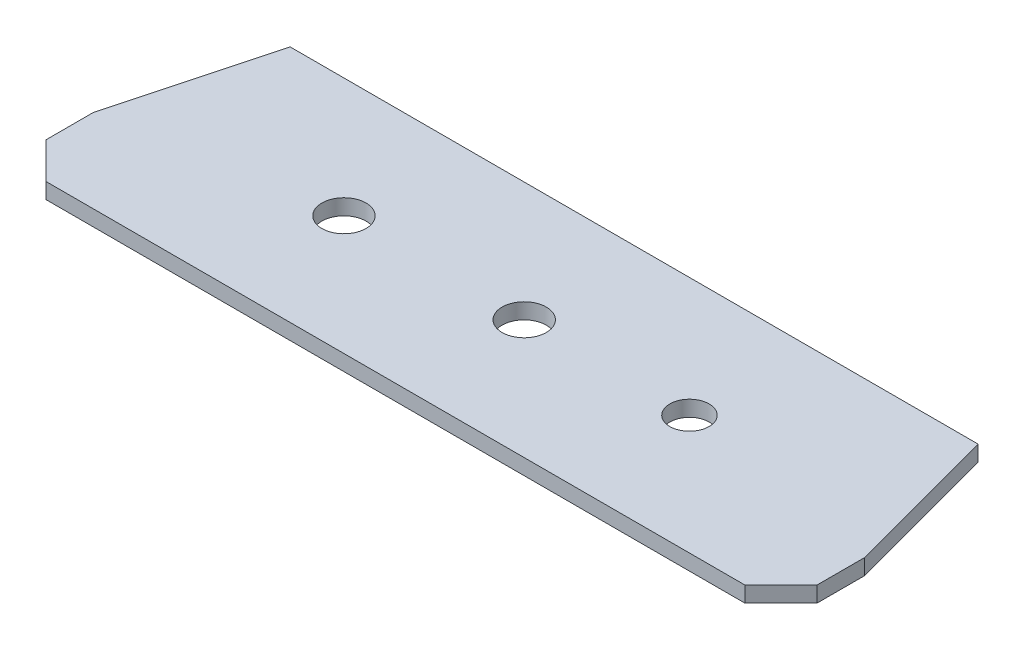
ISO-10303-21;
HEADER;
FILE_DESCRIPTION(('STEP AP214'),'2;1');
FILE_NAME('part.step','',(''),(''),'','','');
FILE_SCHEMA(('AUTOMOTIVE_DESIGN { 1 0 10303 214 1 1 1 1 }'));
ENDSEC;
DATA;
#1=APPLICATION_CONTEXT('core data for automotive mechanical design processes');
#2=APPLICATION_PROTOCOL_DEFINITION('international standard','automotive_design',2000,#1);
#3=PRODUCT_CONTEXT('',#1,'mechanical');
#4=PRODUCT('Part','Part','',(#3));
#5=PRODUCT_RELATED_PRODUCT_CATEGORY('part','',(#4));
#6=PRODUCT_DEFINITION_FORMATION('','',#4);
#7=PRODUCT_DEFINITION_CONTEXT('part definition',#1,'design');
#8=PRODUCT_DEFINITION('design','',#6,#7);
#9=PRODUCT_DEFINITION_SHAPE('','',#8);
#10=(LENGTH_UNIT() NAMED_UNIT(*) SI_UNIT(.MILLI.,.METRE.));
#11=(NAMED_UNIT(*) PLANE_ANGLE_UNIT() SI_UNIT($,.RADIAN.));
#12=(NAMED_UNIT(*) SI_UNIT($,.STERADIAN.) SOLID_ANGLE_UNIT());
#13=UNCERTAINTY_MEASURE_WITH_UNIT(LENGTH_MEASURE(1.E-05),#10,'distance_accuracy_value','');
#14=(GEOMETRIC_REPRESENTATION_CONTEXT(3) GLOBAL_UNCERTAINTY_ASSIGNED_CONTEXT((#13)) GLOBAL_UNIT_ASSIGNED_CONTEXT((#10,
#11,#12)) REPRESENTATION_CONTEXT('',''));
#15=CARTESIAN_POINT('',(0.,0.,0.));
#16=DIRECTION('',(0.,0.,1.));
#17=DIRECTION('',(1.,0.,0.));
#18=AXIS2_PLACEMENT_3D('',#15,#16,#17);
#19=CARTESIAN_POINT('',(-38.6715,2.54,38.6715));
#20=DIRECTION('',(-0.707106781186548,0.,0.707106781186547));
#21=DIRECTION('',(0.707106781186547,0.,0.707106781186548));
#22=AXIS2_PLACEMENT_3D('',#19,#20,#21);
#23=PLANE('',#22);
#24=DIRECTION('',(-0.707106781186547,0.,-0.707106781186548));
#25=VECTOR('',#24,1.);
#26=CARTESIAN_POINT('',(-38.6715,0.,38.6715));
#27=LINE('',#26,#25);
#28=CARTESIAN_POINT('',(-58.039,0.,19.304));
#29=VERTEX_POINT('',#28);
#30=CARTESIAN_POINT('',(-63.881,0.,13.462));
#31=VERTEX_POINT('',#30);
#32=EDGE_CURVE('E128',#29,#31,#27,.T.);
#33=ORIENTED_EDGE('',*,*,#32,.F.);
#34=DIRECTION('',(0.,-1.,0.));
#35=VECTOR('',#34,1.);
#36=CARTESIAN_POINT('',(-58.039,2.54,19.304));
#37=LINE('',#36,#35);
#38=CARTESIAN_POINT('',(-58.039,2.54,19.304));
#39=VERTEX_POINT('',#38);
#40=EDGE_CURVE('E11',#39,#29,#37,.T.);
#41=ORIENTED_EDGE('',*,*,#40,.F.);
#42=DIRECTION('',(-0.707106781186547,0.,-0.707106781186548));
#43=VECTOR('',#42,1.);
#44=CARTESIAN_POINT('',(-38.6715,2.54,38.6715));
#45=LINE('',#44,#43);
#46=CARTESIAN_POINT('',(-63.881,2.54,13.462));
#47=VERTEX_POINT('',#46);
#48=EDGE_CURVE('E146',#39,#47,#45,.T.);
#49=ORIENTED_EDGE('',*,*,#48,.T.);
#50=DIRECTION('',(0.,-1.,0.));
#51=VECTOR('',#50,1.);
#52=CARTESIAN_POINT('',(-63.881,2.54,13.462));
#53=LINE('',#52,#51);
#54=EDGE_CURVE('E51',#47,#31,#53,.T.);
#55=ORIENTED_EDGE('',*,*,#54,.T.);
#56=EDGE_LOOP('',(#33,#41,#49,#55));
#57=FACE_BOUND('',#56,.T.);
#58=ADVANCED_FACE('F35',(#57),#23,.T.);
#59=CARTESIAN_POINT('',(0.,2.54,19.304));
#60=DIRECTION('',(0.,0.,-1.));
#61=DIRECTION('',(-1.,0.,0.));
#62=AXIS2_PLACEMENT_3D('',#59,#60,#61);
#63=PLANE('',#62);
#64=DIRECTION('',(1.,0.,0.));
#65=VECTOR('',#64,1.);
#66=CARTESIAN_POINT('',(0.,0.,19.304));
#67=LINE('',#66,#65);
#68=CARTESIAN_POINT('',(54.991,0.,19.304));
#69=VERTEX_POINT('',#68);
#70=EDGE_CURVE('E130',#29,#69,#67,.T.);
#71=ORIENTED_EDGE('',*,*,#70,.T.);
#72=DIRECTION('',(0.,-1.,0.));
#73=VECTOR('',#72,1.);
#74=CARTESIAN_POINT('',(54.991,2.54,19.304));
#75=LINE('',#74,#73);
#76=CARTESIAN_POINT('',(54.991,2.54,19.304));
#77=VERTEX_POINT('',#76);
#78=EDGE_CURVE('E43',#77,#69,#75,.T.);
#79=ORIENTED_EDGE('',*,*,#78,.F.);
#80=DIRECTION('',(1.,0.,0.));
#81=VECTOR('',#80,1.);
#82=CARTESIAN_POINT('',(0.,2.54,19.304));
#83=LINE('',#82,#81);
#84=EDGE_CURVE('E179',#39,#77,#83,.T.);
#85=ORIENTED_EDGE('',*,*,#84,.F.);
#86=ORIENTED_EDGE('',*,*,#40,.T.);
#87=EDGE_LOOP('',(#71,#79,#85,#86));
#88=FACE_BOUND('',#87,.T.);
#89=ADVANCED_FACE('F230',(#88),#63,.F.);
#90=CARTESIAN_POINT('',(37.1475000000001,2.54,37.1475));
#91=DIRECTION('',(-0.707106781186549,0.,-0.707106781186546));
#92=DIRECTION('',(-0.707106781186546,0.,0.707106781186549));
#93=AXIS2_PLACEMENT_3D('',#90,#91,#92);
#94=PLANE('',#93);
#95=DIRECTION('',(0.707106781186546,0.,-0.707106781186549));
#96=VECTOR('',#95,1.);
#97=CARTESIAN_POINT('',(37.1475000000001,0.,37.1475));
#98=LINE('',#97,#96);
#99=CARTESIAN_POINT('',(60.833,0.,13.462));
#100=VERTEX_POINT('',#99);
#101=EDGE_CURVE('E133',#69,#100,#98,.T.);
#102=ORIENTED_EDGE('',*,*,#101,.T.);
#103=DIRECTION('',(0.,-1.,0.));
#104=VECTOR('',#103,1.);
#105=CARTESIAN_POINT('',(60.833,2.54,13.462));
#106=LINE('',#105,#104);
#107=CARTESIAN_POINT('',(60.833,2.54,13.462));
#108=VERTEX_POINT('',#107);
#109=EDGE_CURVE('E153',#108,#100,#106,.T.);
#110=ORIENTED_EDGE('',*,*,#109,.F.);
#111=DIRECTION('',(0.707106781186546,0.,-0.707106781186549));
#112=VECTOR('',#111,1.);
#113=CARTESIAN_POINT('',(37.1475000000001,2.54,37.1475));
#114=LINE('',#113,#112);
#115=EDGE_CURVE('E162',#77,#108,#114,.T.);
#116=ORIENTED_EDGE('',*,*,#115,.F.);
#117=ORIENTED_EDGE('',*,*,#78,.T.);
#118=EDGE_LOOP('',(#102,#110,#116,#117));
#119=FACE_BOUND('',#118,.T.);
#120=ADVANCED_FACE('F160',(#119),#94,.F.);
#121=CARTESIAN_POINT('',(60.833,2.54,0.));
#122=DIRECTION('',(-1.,0.,0.));
#123=DIRECTION('',(0.,0.,1.));
#124=AXIS2_PLACEMENT_3D('',#121,#122,#123);
#125=PLANE('',#124);
#126=DIRECTION('',(0.,0.,-1.));
#127=VECTOR('',#126,1.);
#128=CARTESIAN_POINT('',(60.833,0.,0.));
#129=LINE('',#128,#127);
#130=CARTESIAN_POINT('',(60.833,0.,5.82667054017809));
#131=VERTEX_POINT('',#130);
#132=EDGE_CURVE('E135',#100,#131,#129,.T.);
#133=ORIENTED_EDGE('',*,*,#132,.T.);
#134=DIRECTION('',(0.,-1.,0.));
#135=VECTOR('',#134,1.);
#136=CARTESIAN_POINT('',(60.833,2.54,5.82667054017809));
#137=LINE('',#136,#135);
#138=CARTESIAN_POINT('',(60.833,2.54,5.82667054017809));
#139=VERTEX_POINT('',#138);
#140=EDGE_CURVE('E150',#139,#131,#137,.T.);
#141=ORIENTED_EDGE('',*,*,#140,.F.);
#142=DIRECTION('',(0.,0.,-1.));
#143=VECTOR('',#142,1.);
#144=CARTESIAN_POINT('',(60.833,2.54,0.));
#145=LINE('',#144,#143);
#146=EDGE_CURVE('E175',#108,#139,#145,.T.);
#147=ORIENTED_EDGE('',*,*,#146,.F.);
#148=ORIENTED_EDGE('',*,*,#109,.T.);
#149=EDGE_LOOP('',(#133,#141,#147,#148));
#150=FACE_BOUND('',#149,.T.);
#151=ADVANCED_FACE('F171',(#150),#125,.F.);
#152=CARTESIAN_POINT('',(55.3012940591647,2.54,-14.8179370835495));
#153=DIRECTION('',(-0.965925826289067,0.,0.258819045102525));
#154=DIRECTION('',(0.258819045102525,0.,0.965925826289067));
#155=AXIS2_PLACEMENT_3D('',#152,#153,#154);
#156=PLANE('',#155);
#157=DIRECTION('',(-0.258819045102525,0.,-0.965925826289067));
#158=VECTOR('',#157,1.);
#159=CARTESIAN_POINT('',(55.3012940591647,0.,-14.8179370835495));
#160=LINE('',#159,#158);
#161=CARTESIAN_POINT('',(54.102,0.,-19.2937634455677));
#162=VERTEX_POINT('',#161);
#163=EDGE_CURVE('E137',#131,#162,#160,.T.);
#164=ORIENTED_EDGE('',*,*,#163,.T.);
#165=DIRECTION('',(0.,-1.,0.));
#166=VECTOR('',#165,1.);
#167=CARTESIAN_POINT('',(54.102,2.54,-19.2937634455677));
#168=LINE('',#167,#166);
#169=CARTESIAN_POINT('',(54.102,2.54,-19.2937634455677));
#170=VERTEX_POINT('',#169);
#171=EDGE_CURVE('E110',#170,#162,#168,.T.);
#172=ORIENTED_EDGE('',*,*,#171,.F.);
#173=DIRECTION('',(-0.258819045102525,0.,-0.965925826289067));
#174=VECTOR('',#173,1.);
#175=CARTESIAN_POINT('',(55.3012940591647,2.54,-14.8179370835495));
#176=LINE('',#175,#174);
#177=EDGE_CURVE('E119',#139,#170,#176,.T.);
#178=ORIENTED_EDGE('',*,*,#177,.F.);
#179=ORIENTED_EDGE('',*,*,#140,.T.);
#180=EDGE_LOOP('',(#164,#172,#178,#179));
#181=FACE_BOUND('',#180,.T.);
#182=ADVANCED_FACE('F174',(#181),#156,.F.);
#183=CARTESIAN_POINT('',(0.,2.54,-19.2937634455677));
#184=DIRECTION('',(0.,0.,-1.));
#185=DIRECTION('',(-1.,0.,0.));
#186=AXIS2_PLACEMENT_3D('',#183,#184,#185);
#187=PLANE('',#186);
#188=DIRECTION('',(1.,0.,0.));
#189=VECTOR('',#188,1.);
#190=CARTESIAN_POINT('',(0.,0.,-19.2937634455677));
#191=LINE('',#190,#189);
#192=CARTESIAN_POINT('',(-57.15,0.,-19.2937634455677));
#193=VERTEX_POINT('',#192);
#194=EDGE_CURVE('E106',#193,#162,#191,.T.);
#195=ORIENTED_EDGE('',*,*,#194,.F.);
#196=DIRECTION('',(0.,-1.,0.));
#197=VECTOR('',#196,1.);
#198=CARTESIAN_POINT('',(-57.15,2.54,-19.2937634455677));
#199=LINE('',#198,#197);
#200=CARTESIAN_POINT('',(-57.15,2.54,-19.2937634455677));
#201=VERTEX_POINT('',#200);
#202=EDGE_CURVE('E101',#201,#193,#199,.T.);
#203=ORIENTED_EDGE('',*,*,#202,.F.);
#204=DIRECTION('',(1.,0.,0.));
#205=VECTOR('',#204,1.);
#206=CARTESIAN_POINT('',(0.,2.54,-19.2937634455677));
#207=LINE('',#206,#205);
#208=EDGE_CURVE('E104',#201,#170,#207,.T.);
#209=ORIENTED_EDGE('',*,*,#208,.T.);
#210=ORIENTED_EDGE('',*,*,#171,.T.);
#211=EDGE_LOOP('',(#195,#203,#209,#210));
#212=FACE_BOUND('',#211,.T.);
#213=ADVANCED_FACE('F103',(#212),#187,.T.);
#214=CARTESIAN_POINT('',(-58.1451167745322,2.54,-15.5799370835494));
#215=DIRECTION('',(-0.965925826289067,0.,-0.258819045102524));
#216=DIRECTION('',(-0.258819045102524,0.,0.965925826289068));
#217=AXIS2_PLACEMENT_3D('',#214,#215,#216);
#218=PLANE('',#217);
#219=DIRECTION('',(0.258819045102524,0.,-0.965925826289067));
#220=VECTOR('',#219,1.);
#221=CARTESIAN_POINT('',(-58.1451167745322,0.,-15.5799370835494));
#222=LINE('',#221,#220);
#223=CARTESIAN_POINT('',(-63.881,0.,5.82667054017811));
#224=VERTEX_POINT('',#223);
#225=EDGE_CURVE('E141',#224,#193,#222,.T.);
#226=ORIENTED_EDGE('',*,*,#225,.F.);
#227=DIRECTION('',(0.,-1.,0.));
#228=VECTOR('',#227,1.);
#229=CARTESIAN_POINT('',(-63.881,2.54,5.82667054017811));
#230=LINE('',#229,#228);
#231=CARTESIAN_POINT('',(-63.881,2.54,5.82667054017811));
#232=VERTEX_POINT('',#231);
#233=EDGE_CURVE('E76',#232,#224,#230,.T.);
#234=ORIENTED_EDGE('',*,*,#233,.F.);
#235=DIRECTION('',(0.258819045102524,0.,-0.965925826289067));
#236=VECTOR('',#235,1.);
#237=CARTESIAN_POINT('',(-58.1451167745322,2.54,-15.5799370835494));
#238=LINE('',#237,#236);
#239=EDGE_CURVE('E117',#232,#201,#238,.T.);
#240=ORIENTED_EDGE('',*,*,#239,.T.);
#241=ORIENTED_EDGE('',*,*,#202,.T.);
#242=EDGE_LOOP('',(#226,#234,#240,#241));
#243=FACE_BOUND('',#242,.T.);
#244=ADVANCED_FACE('F122',(#243),#218,.T.);
#245=CARTESIAN_POINT('',(-63.881,2.54,0.));
#246=DIRECTION('',(-1.,0.,0.));
#247=DIRECTION('',(0.,0.,1.));
#248=AXIS2_PLACEMENT_3D('',#245,#246,#247);
#249=PLANE('',#248);
#250=DIRECTION('',(0.,0.,-1.));
#251=VECTOR('',#250,1.);
#252=CARTESIAN_POINT('',(-63.881,0.,0.));
#253=LINE('',#252,#251);
#254=EDGE_CURVE('E143',#31,#224,#253,.T.);
#255=ORIENTED_EDGE('',*,*,#254,.F.);
#256=ORIENTED_EDGE('',*,*,#54,.F.);
#257=DIRECTION('',(0.,0.,-1.));
#258=VECTOR('',#257,1.);
#259=CARTESIAN_POINT('',(-63.881,2.54,0.));
#260=LINE('',#259,#258);
#261=EDGE_CURVE('E123',#47,#232,#260,.T.);
#262=ORIENTED_EDGE('',*,*,#261,.T.);
#263=ORIENTED_EDGE('',*,*,#233,.T.);
#264=EDGE_LOOP('',(#255,#256,#262,#263));
#265=FACE_BOUND('',#264,.T.);
#266=ADVANCED_FACE('F211',(#265),#249,.T.);
#267=CARTESIAN_POINT('',(0.,2.54,0.));
#268=DIRECTION('',(0.,1.,0.));
#269=DIRECTION('',(0.,0.,1.));
#270=AXIS2_PLACEMENT_3D('',#267,#268,#269);
#271=PLANE('',#270);
#272=CARTESIAN_POINT('',(26.7335,2.54,0.0051182772161755));
#273=DIRECTION('',(0.,1.,0.));
#274=DIRECTION('',(0.,0.,1.));
#275=AXIS2_PLACEMENT_3D('',#272,#273,#274);
#276=CIRCLE('',#275,3.175);
#277=CARTESIAN_POINT('',(26.7335,2.54,3.18011827721618));
#278=VERTEX_POINT('',#277);
#279=EDGE_CURVE('E194',#278,#278,#276,.T.);
#280=ORIENTED_EDGE('',*,*,#279,.F.);
#281=EDGE_LOOP('',(#280));
#282=FACE_BOUND('',#281,.T.);
#283=CARTESIAN_POINT('',(0.,2.54,0.));
#284=DIRECTION('',(0.,1.,0.));
#285=DIRECTION('',(0.,0.,1.));
#286=AXIS2_PLACEMENT_3D('',#283,#284,#285);
#287=CIRCLE('',#286,3.571875);
#288=CARTESIAN_POINT('',(0.,2.54,3.571875));
#289=VERTEX_POINT('',#288);
#290=EDGE_CURVE('E188',#289,#289,#287,.T.);
#291=ORIENTED_EDGE('',*,*,#290,.F.);
#292=EDGE_LOOP('',(#291));
#293=FACE_BOUND('',#292,.T.);
#294=CARTESIAN_POINT('',(-29.1465,2.54,0.0051182772161807));
#295=DIRECTION('',(0.,1.,0.));
#296=DIRECTION('',(0.,0.,1.));
#297=AXIS2_PLACEMENT_3D('',#294,#295,#296);
#298=CIRCLE('',#297,3.571875);
#299=CARTESIAN_POINT('',(-29.1465,2.54,3.57699327721618));
#300=VERTEX_POINT('',#299);
#301=EDGE_CURVE('E182',#300,#300,#298,.T.);
#302=ORIENTED_EDGE('',*,*,#301,.F.);
#303=EDGE_LOOP('',(#302));
#304=FACE_BOUND('',#303,.T.);
#305=ORIENTED_EDGE('',*,*,#48,.F.);
#306=ORIENTED_EDGE('',*,*,#84,.T.);
#307=ORIENTED_EDGE('',*,*,#115,.T.);
#308=ORIENTED_EDGE('',*,*,#146,.T.);
#309=ORIENTED_EDGE('',*,*,#177,.T.);
#310=ORIENTED_EDGE('',*,*,#208,.F.);
#311=ORIENTED_EDGE('',*,*,#239,.F.);
#312=ORIENTED_EDGE('',*,*,#261,.F.);
#313=EDGE_LOOP('',(#305,#306,#307,#308,#309,#310,#311,#312));
#314=FACE_BOUND('',#313,.T.);
#315=ADVANCED_FACE('F115',(#282,#293,#304,#314),#271,.T.);
#316=CARTESIAN_POINT('',(0.,0.,0.));
#317=DIRECTION('',(0.,1.,0.));
#318=DIRECTION('',(0.,0.,1.));
#319=AXIS2_PLACEMENT_3D('',#316,#317,#318);
#320=PLANE('',#319);
#321=CARTESIAN_POINT('',(26.7335,0.,0.0051182772161755));
#322=DIRECTION('',(0.,1.,0.));
#323=DIRECTION('',(0.,0.,1.));
#324=AXIS2_PLACEMENT_3D('',#321,#322,#323);
#325=CIRCLE('',#324,3.175);
#326=CARTESIAN_POINT('',(26.7335,0.,3.18011827721618));
#327=VERTEX_POINT('',#326);
#328=EDGE_CURVE('E191',#327,#327,#325,.T.);
#329=ORIENTED_EDGE('',*,*,#328,.T.);
#330=EDGE_LOOP('',(#329));
#331=FACE_BOUND('',#330,.T.);
#332=CARTESIAN_POINT('',(0.,0.,0.));
#333=DIRECTION('',(0.,1.,0.));
#334=DIRECTION('',(0.,0.,1.));
#335=AXIS2_PLACEMENT_3D('',#332,#333,#334);
#336=CIRCLE('',#335,3.571875);
#337=CARTESIAN_POINT('',(0.,0.,3.571875));
#338=VERTEX_POINT('',#337);
#339=EDGE_CURVE('E185',#338,#338,#336,.T.);
#340=ORIENTED_EDGE('',*,*,#339,.T.);
#341=EDGE_LOOP('',(#340));
#342=FACE_BOUND('',#341,.T.);
#343=CARTESIAN_POINT('',(-29.1465,0.,0.0051182772161807));
#344=DIRECTION('',(0.,1.,0.));
#345=DIRECTION('',(0.,0.,1.));
#346=AXIS2_PLACEMENT_3D('',#343,#344,#345);
#347=CIRCLE('',#346,3.571875);
#348=CARTESIAN_POINT('',(-29.1465,0.,3.57699327721618));
#349=VERTEX_POINT('',#348);
#350=EDGE_CURVE('E131',#349,#349,#347,.T.);
#351=ORIENTED_EDGE('',*,*,#350,.T.);
#352=EDGE_LOOP('',(#351));
#353=FACE_BOUND('',#352,.T.);
#354=ORIENTED_EDGE('',*,*,#32,.T.);
#355=ORIENTED_EDGE('',*,*,#254,.T.);
#356=ORIENTED_EDGE('',*,*,#225,.T.);
#357=ORIENTED_EDGE('',*,*,#194,.T.);
#358=ORIENTED_EDGE('',*,*,#163,.F.);
#359=ORIENTED_EDGE('',*,*,#132,.F.);
#360=ORIENTED_EDGE('',*,*,#101,.F.);
#361=ORIENTED_EDGE('',*,*,#70,.F.);
#362=EDGE_LOOP('',(#354,#355,#356,#357,#358,#359,#360,#361));
#363=FACE_BOUND('',#362,.T.);
#364=ADVANCED_FACE('F167',(#331,#342,#353,#363),#320,.F.);
#365=CARTESIAN_POINT('',(-29.1465,0.,0.0051182772161807));
#366=DIRECTION('',(0.,1.,0.));
#367=DIRECTION('',(0.,0.,1.));
#368=AXIS2_PLACEMENT_3D('',#365,#366,#367);
#369=CYLINDRICAL_SURFACE('',#368,3.571875);
#370=ORIENTED_EDGE('',*,*,#350,.F.);
#371=EDGE_LOOP('',(#370));
#372=FACE_BOUND('',#371,.T.);
#373=ORIENTED_EDGE('',*,*,#301,.T.);
#374=EDGE_LOOP('',(#373));
#375=FACE_BOUND('',#374,.T.);
#376=ADVANCED_FACE('F217',(#372,#375),#369,.F.);
#377=CARTESIAN_POINT('',(0.,0.,0.));
#378=DIRECTION('',(0.,1.,0.));
#379=DIRECTION('',(0.,0.,1.));
#380=AXIS2_PLACEMENT_3D('',#377,#378,#379);
#381=CYLINDRICAL_SURFACE('',#380,3.571875);
#382=ORIENTED_EDGE('',*,*,#339,.F.);
#383=EDGE_LOOP('',(#382));
#384=FACE_BOUND('',#383,.T.);
#385=ORIENTED_EDGE('',*,*,#290,.T.);
#386=EDGE_LOOP('',(#385));
#387=FACE_BOUND('',#386,.T.);
#388=ADVANCED_FACE('F205',(#384,#387),#381,.F.);
#389=CARTESIAN_POINT('',(26.7335,0.,0.0051182772161755));
#390=DIRECTION('',(0.,1.,0.));
#391=DIRECTION('',(0.,0.,1.));
#392=AXIS2_PLACEMENT_3D('',#389,#390,#391);
#393=CYLINDRICAL_SURFACE('',#392,3.175);
#394=ORIENTED_EDGE('',*,*,#328,.F.);
#395=EDGE_LOOP('',(#394));
#396=FACE_BOUND('',#395,.T.);
#397=ORIENTED_EDGE('',*,*,#279,.T.);
#398=EDGE_LOOP('',(#397));
#399=FACE_BOUND('',#398,.T.);
#400=ADVANCED_FACE('F202',(#396,#399),#393,.F.);
#401=CLOSED_SHELL('',(#58,#89,#120,#151,#182,#213,#244,#266,#315,#364,#376,#388,#400));
#402=MANIFOLD_SOLID_BREP('B2',#401);
#403=ADVANCED_BREP_SHAPE_REPRESENTATION('',(#18,#402),#14);
#404=SHAPE_DEFINITION_REPRESENTATION(#9,#403);
ENDSEC;
END-ISO-10303-21;
